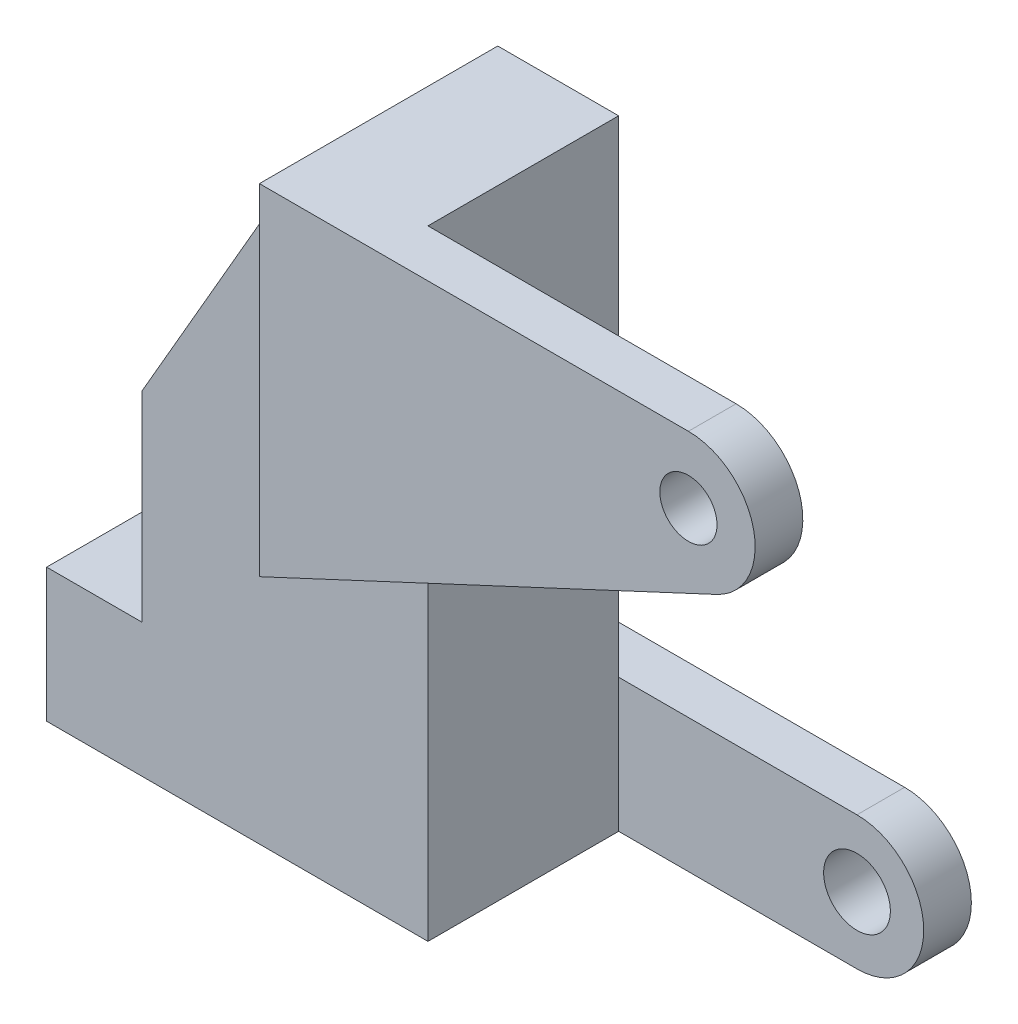
ISO-10303-21;
HEADER;
FILE_DESCRIPTION(('STEP AP214'),'2;1');
FILE_NAME('part.step','',(''),(''),'','','');
FILE_SCHEMA(('AUTOMOTIVE_DESIGN { 1 0 10303 214 1 1 1 1 }'));
ENDSEC;
DATA;
#1=APPLICATION_CONTEXT('core data for automotive mechanical design processes');
#2=APPLICATION_PROTOCOL_DEFINITION('international standard','automotive_design',2000,#1);
#3=PRODUCT_CONTEXT('',#1,'mechanical');
#4=PRODUCT('Part','Part','',(#3));
#5=PRODUCT_RELATED_PRODUCT_CATEGORY('part','',(#4));
#6=PRODUCT_DEFINITION_FORMATION('','',#4);
#7=PRODUCT_DEFINITION_CONTEXT('part definition',#1,'design');
#8=PRODUCT_DEFINITION('design','',#6,#7);
#9=PRODUCT_DEFINITION_SHAPE('','',#8);
#10=(LENGTH_UNIT() NAMED_UNIT(*) SI_UNIT(.MILLI.,.METRE.));
#11=(NAMED_UNIT(*) PLANE_ANGLE_UNIT() SI_UNIT($,.RADIAN.));
#12=(NAMED_UNIT(*) SI_UNIT($,.STERADIAN.) SOLID_ANGLE_UNIT());
#13=UNCERTAINTY_MEASURE_WITH_UNIT(LENGTH_MEASURE(1.E-05),#10,'distance_accuracy_value','');
#14=(GEOMETRIC_REPRESENTATION_CONTEXT(3) GLOBAL_UNCERTAINTY_ASSIGNED_CONTEXT((#13)) GLOBAL_UNIT_ASSIGNED_CONTEXT((#10,
#11,#12)) REPRESENTATION_CONTEXT('',''));
#15=CARTESIAN_POINT('',(0.,0.,0.));
#16=DIRECTION('',(0.,0.,1.));
#17=DIRECTION('',(1.,0.,0.));
#18=AXIS2_PLACEMENT_3D('',#15,#16,#17);
#19=CARTESIAN_POINT('',(0.,0.,0.));
#20=DIRECTION('',(0.,0.,-1.));
#21=DIRECTION('',(-1.,0.,0.));
#22=AXIS2_PLACEMENT_3D('',#19,#20,#21);
#23=PLANE('',#22);
#24=DIRECTION('',(-1.,0.,0.));
#25=VECTOR('',#24,1.);
#26=CARTESIAN_POINT('',(0.,14.,0.));
#27=LINE('',#26,#25);
#28=CARTESIAN_POINT('',(10.,14.,0.));
#29=VERTEX_POINT('',#28);
#30=CARTESIAN_POINT('',(0.,14.,0.));
#31=VERTEX_POINT('',#30);
#32=EDGE_CURVE('E218',#29,#31,#27,.T.);
#33=ORIENTED_EDGE('',*,*,#32,.F.);
#34=DIRECTION('',(0.,-1.,0.));
#35=VECTOR('',#34,1.);
#36=CARTESIAN_POINT('',(10.,0.,0.));
#37=LINE('',#36,#35);
#38=CARTESIAN_POINT('',(10.,0.,0.));
#39=VERTEX_POINT('',#38);
#40=EDGE_CURVE('E272',#29,#39,#37,.T.);
#41=ORIENTED_EDGE('',*,*,#40,.T.);
#42=DIRECTION('',(1.,0.,0.));
#43=VECTOR('',#42,1.);
#44=CARTESIAN_POINT('',(0.,0.,0.));
#45=LINE('',#44,#43);
#46=CARTESIAN_POINT('',(0.,0.,0.));
#47=VERTEX_POINT('',#46);
#48=EDGE_CURVE('E235',#47,#39,#45,.T.);
#49=ORIENTED_EDGE('',*,*,#48,.F.);
#50=DIRECTION('',(0.,-1.,0.));
#51=VECTOR('',#50,1.);
#52=CARTESIAN_POINT('',(0.,0.,0.));
#53=LINE('',#52,#51);
#54=EDGE_CURVE('E212',#31,#47,#53,.T.);
#55=ORIENTED_EDGE('',*,*,#54,.F.);
#56=EDGE_LOOP('',(#33,#41,#49,#55));
#57=FACE_BOUND('',#56,.T.);
#58=ADVANCED_FACE('F39',(#57),#23,.T.);
#59=CARTESIAN_POINT('',(0.,0.,20.));
#60=DIRECTION('',(1.,0.,0.));
#61=DIRECTION('',(0.,0.,-1.));
#62=AXIS2_PLACEMENT_3D('',#59,#60,#61);
#63=PLANE('',#62);
#64=ORIENTED_EDGE('',*,*,#54,.T.);
#65=DIRECTION('',(0.,0.,-1.));
#66=VECTOR('',#65,1.);
#67=CARTESIAN_POINT('',(0.,0.,20.));
#68=LINE('',#67,#66);
#69=CARTESIAN_POINT('',(0.,0.,20.));
#70=VERTEX_POINT('',#69);
#71=EDGE_CURVE('E43',#70,#47,#68,.T.);
#72=ORIENTED_EDGE('',*,*,#71,.F.);
#73=DIRECTION('',(0.,-1.,0.));
#74=VECTOR('',#73,1.);
#75=CARTESIAN_POINT('',(0.,0.,20.));
#76=LINE('',#75,#74);
#77=CARTESIAN_POINT('',(0.,14.,20.));
#78=VERTEX_POINT('',#77);
#79=EDGE_CURVE('E214',#78,#70,#76,.T.);
#80=ORIENTED_EDGE('',*,*,#79,.F.);
#81=DIRECTION('',(0.,0.,-1.));
#82=VECTOR('',#81,1.);
#83=CARTESIAN_POINT('',(0.,14.,20.));
#84=LINE('',#83,#82);
#85=EDGE_CURVE('E226',#78,#31,#84,.T.);
#86=ORIENTED_EDGE('',*,*,#85,.T.);
#87=EDGE_LOOP('',(#64,#72,#80,#86));
#88=FACE_BOUND('',#87,.T.);
#89=ADVANCED_FACE('F41',(#88),#63,.F.);
#90=CARTESIAN_POINT('',(0.,0.,20.));
#91=DIRECTION('',(0.,1.,0.));
#92=DIRECTION('',(0.,0.,1.));
#93=AXIS2_PLACEMENT_3D('',#90,#91,#92);
#94=PLANE('',#93);
#95=ORIENTED_EDGE('',*,*,#48,.T.);
#96=DIRECTION('',(0.,0.,1.));
#97=VECTOR('',#96,1.);
#98=CARTESIAN_POINT('',(10.,0.,-5.));
#99=LINE('',#98,#97);
#100=CARTESIAN_POINT('',(10.,0.,-5.));
#101=VERTEX_POINT('',#100);
#102=EDGE_CURVE('E57',#101,#39,#99,.T.);
#103=ORIENTED_EDGE('',*,*,#102,.F.);
#104=DIRECTION('',(-1.,0.,0.));
#105=VECTOR('',#104,1.);
#106=CARTESIAN_POINT('',(0.,0.,-5.));
#107=LINE('',#106,#105);
#108=CARTESIAN_POINT('',(65.,0.,-5.));
#109=VERTEX_POINT('',#108);
#110=EDGE_CURVE('E157',#109,#101,#107,.T.);
#111=ORIENTED_EDGE('',*,*,#110,.F.);
#112=DIRECTION('',(0.,0.,1.));
#113=VECTOR('',#112,1.);
#114=CARTESIAN_POINT('',(65.,0.,-5.));
#115=LINE('',#114,#113);
#116=CARTESIAN_POINT('',(65.,0.,0.));
#117=VERTEX_POINT('',#116);
#118=EDGE_CURVE('E156',#109,#117,#115,.T.);
#119=ORIENTED_EDGE('',*,*,#118,.T.);
#120=DIRECTION('',(-1.,0.,0.));
#121=VECTOR('',#120,1.);
#122=CARTESIAN_POINT('',(0.,0.,0.));
#123=LINE('',#122,#121);
#124=CARTESIAN_POINT('',(40.,0.,0.));
#125=VERTEX_POINT('',#124);
#126=EDGE_CURVE('E274',#117,#125,#123,.T.);
#127=ORIENTED_EDGE('',*,*,#126,.T.);
#128=DIRECTION('',(0.,0.,-1.));
#129=VECTOR('',#128,1.);
#130=CARTESIAN_POINT('',(40.,0.,20.));
#131=LINE('',#130,#129);
#132=CARTESIAN_POINT('',(40.,0.,20.));
#133=VERTEX_POINT('',#132);
#134=EDGE_CURVE('E257',#133,#125,#131,.T.);
#135=ORIENTED_EDGE('',*,*,#134,.F.);
#136=DIRECTION('',(1.,0.,0.));
#137=VECTOR('',#136,1.);
#138=CARTESIAN_POINT('',(0.,0.,20.));
#139=LINE('',#138,#137);
#140=EDGE_CURVE('E217',#70,#133,#139,.T.);
#141=ORIENTED_EDGE('',*,*,#140,.F.);
#142=ORIENTED_EDGE('',*,*,#71,.T.);
#143=EDGE_LOOP('',(#95,#103,#111,#119,#127,#135,#141,#142));
#144=FACE_BOUND('',#143,.T.);
#145=ADVANCED_FACE('F266',(#144),#94,.F.);
#146=CARTESIAN_POINT('',(40.,0.,20.));
#147=DIRECTION('',(-1.,0.,0.));
#148=DIRECTION('',(0.,0.,1.));
#149=AXIS2_PLACEMENT_3D('',#146,#147,#148);
#150=PLANE('',#149);
#151=DIRECTION('',(0.,1.,0.));
#152=VECTOR('',#151,1.);
#153=CARTESIAN_POINT('',(40.,0.,0.));
#154=LINE('',#153,#152);
#155=CARTESIAN_POINT('',(40.,14.,0.));
#156=VERTEX_POINT('',#155);
#157=EDGE_CURVE('E237',#125,#156,#154,.T.);
#158=ORIENTED_EDGE('',*,*,#157,.T.);
#159=CARTESIAN_POINT('',(40.,65.,0.));
#160=VERTEX_POINT('',#159);
#161=EDGE_CURVE('E233',#156,#160,#154,.T.);
#162=ORIENTED_EDGE('',*,*,#161,.T.);
#163=DIRECTION('',(0.,0.,-1.));
#164=VECTOR('',#163,1.);
#165=CARTESIAN_POINT('',(40.,65.,20.));
#166=LINE('',#165,#164);
#167=CARTESIAN_POINT('',(40.,65.,20.));
#168=VERTEX_POINT('',#167);
#169=EDGE_CURVE('E256',#168,#160,#166,.T.);
#170=ORIENTED_EDGE('',*,*,#169,.F.);
#171=DIRECTION('',(0.,1.,0.));
#172=VECTOR('',#171,1.);
#173=CARTESIAN_POINT('',(40.,0.,20.));
#174=LINE('',#173,#172);
#175=CARTESIAN_POINT('',(40.,35.2050541361082,20.));
#176=VERTEX_POINT('',#175);
#177=EDGE_CURVE('E61',#176,#168,#174,.T.);
#178=ORIENTED_EDGE('',*,*,#177,.F.);
#179=EDGE_CURVE('E222',#133,#176,#174,.T.);
#180=ORIENTED_EDGE('',*,*,#179,.F.);
#181=ORIENTED_EDGE('',*,*,#134,.T.);
#182=EDGE_LOOP('',(#158,#162,#170,#178,#180,#181));
#183=FACE_BOUND('',#182,.T.);
#184=ADVANCED_FACE('F299',(#183),#150,.F.);
#185=CARTESIAN_POINT('',(40.,65.,20.));
#186=DIRECTION('',(0.,-1.,0.));
#187=DIRECTION('',(0.,0.,-1.));
#188=AXIS2_PLACEMENT_3D('',#185,#186,#187);
#189=PLANE('',#188);
#190=DIRECTION('',(-1.,0.,0.));
#191=VECTOR('',#190,1.);
#192=CARTESIAN_POINT('',(40.,65.,0.));
#193=LINE('',#192,#191);
#194=CARTESIAN_POINT('',(27.3205080756888,65.,0.));
#195=VERTEX_POINT('',#194);
#196=EDGE_CURVE('E239',#160,#195,#193,.T.);
#197=ORIENTED_EDGE('',*,*,#196,.T.);
#198=DIRECTION('',(0.,0.,-1.));
#199=VECTOR('',#198,1.);
#200=CARTESIAN_POINT('',(27.3205080756888,65.,20.));
#201=LINE('',#200,#199);
#202=CARTESIAN_POINT('',(27.3205080756888,65.,20.));
#203=VERTEX_POINT('',#202);
#204=EDGE_CURVE('E254',#203,#195,#201,.T.);
#205=ORIENTED_EDGE('',*,*,#204,.F.);
#206=DIRECTION('',(0.,0.,-1.));
#207=VECTOR('',#206,1.);
#208=CARTESIAN_POINT('',(27.3205080756888,65.,25.));
#209=LINE('',#208,#207);
#210=CARTESIAN_POINT('',(27.3205080756888,65.,25.));
#211=VERTEX_POINT('',#210);
#212=EDGE_CURVE('E211',#211,#203,#209,.T.);
#213=ORIENTED_EDGE('',*,*,#212,.F.);
#214=DIRECTION('',(-1.,0.,0.));
#215=VECTOR('',#214,1.);
#216=CARTESIAN_POINT('',(0.,65.,25.));
#217=LINE('',#216,#215);
#218=CARTESIAN_POINT('',(72.3205080756888,65.,25.));
#219=VERTEX_POINT('',#218);
#220=EDGE_CURVE('E185',#219,#211,#217,.T.);
#221=ORIENTED_EDGE('',*,*,#220,.F.);
#222=DIRECTION('',(0.,0.,-1.));
#223=VECTOR('',#222,1.);
#224=CARTESIAN_POINT('',(72.3205080756888,65.,25.));
#225=LINE('',#224,#223);
#226=CARTESIAN_POINT('',(72.3205080756888,65.,20.));
#227=VERTEX_POINT('',#226);
#228=EDGE_CURVE('E193',#219,#227,#225,.T.);
#229=ORIENTED_EDGE('',*,*,#228,.T.);
#230=DIRECTION('',(-1.,0.,0.));
#231=VECTOR('',#230,1.);
#232=CARTESIAN_POINT('',(0.,65.,20.));
#233=LINE('',#232,#231);
#234=EDGE_CURVE('E171',#227,#168,#233,.T.);
#235=ORIENTED_EDGE('',*,*,#234,.T.);
#236=ORIENTED_EDGE('',*,*,#169,.T.);
#237=EDGE_LOOP('',(#197,#205,#213,#221,#229,#235,#236));
#238=FACE_BOUND('',#237,.T.);
#239=ADVANCED_FACE('F304',(#238),#189,.F.);
#240=CARTESIAN_POINT('',(10.,35.,20.));
#241=DIRECTION('',(0.866025403784438,-0.500000000000001,0.));
#242=DIRECTION('',(0.500000000000001,0.866025403784438,0.));
#243=AXIS2_PLACEMENT_3D('',#240,#241,#242);
#244=PLANE('',#243);
#245=DIRECTION('',(-0.500000000000001,-0.866025403784438,0.));
#246=VECTOR('',#245,1.);
#247=CARTESIAN_POINT('',(10.,35.,0.));
#248=LINE('',#247,#246);
#249=CARTESIAN_POINT('',(10.,35.,0.));
#250=VERTEX_POINT('',#249);
#251=EDGE_CURVE('E242',#195,#250,#248,.T.);
#252=ORIENTED_EDGE('',*,*,#251,.T.);
#253=DIRECTION('',(0.,0.,-1.));
#254=VECTOR('',#253,1.);
#255=CARTESIAN_POINT('',(10.,35.,20.));
#256=LINE('',#255,#254);
#257=CARTESIAN_POINT('',(10.,35.,20.));
#258=VERTEX_POINT('',#257);
#259=EDGE_CURVE('E252',#258,#250,#256,.T.);
#260=ORIENTED_EDGE('',*,*,#259,.F.);
#261=DIRECTION('',(-0.500000000000001,-0.866025403784438,0.));
#262=VECTOR('',#261,1.);
#263=CARTESIAN_POINT('',(10.,35.,20.));
#264=LINE('',#263,#262);
#265=EDGE_CURVE('E224',#203,#258,#264,.T.);
#266=ORIENTED_EDGE('',*,*,#265,.F.);
#267=ORIENTED_EDGE('',*,*,#204,.T.);
#268=EDGE_LOOP('',(#252,#260,#266,#267));
#269=FACE_BOUND('',#268,.T.);
#270=ADVANCED_FACE('F313',(#269),#244,.F.);
#271=CARTESIAN_POINT('',(10.,14.,20.));
#272=DIRECTION('',(1.,0.,0.));
#273=DIRECTION('',(0.,0.,-1.));
#274=AXIS2_PLACEMENT_3D('',#271,#272,#273);
#275=PLANE('',#274);
#276=DIRECTION('',(0.,-1.,0.));
#277=VECTOR('',#276,1.);
#278=CARTESIAN_POINT('',(10.,14.,0.));
#279=LINE('',#278,#277);
#280=EDGE_CURVE('E244',#250,#29,#279,.T.);
#281=ORIENTED_EDGE('',*,*,#280,.T.);
#282=DIRECTION('',(0.,0.,-1.));
#283=VECTOR('',#282,1.);
#284=CARTESIAN_POINT('',(10.,14.,20.));
#285=LINE('',#284,#283);
#286=CARTESIAN_POINT('',(10.,14.,20.));
#287=VERTEX_POINT('',#286);
#288=EDGE_CURVE('E246',#287,#29,#285,.T.);
#289=ORIENTED_EDGE('',*,*,#288,.F.);
#290=DIRECTION('',(0.,-1.,0.));
#291=VECTOR('',#290,1.);
#292=CARTESIAN_POINT('',(10.,14.,20.));
#293=LINE('',#292,#291);
#294=EDGE_CURVE('E223',#258,#287,#293,.T.);
#295=ORIENTED_EDGE('',*,*,#294,.F.);
#296=ORIENTED_EDGE('',*,*,#259,.T.);
#297=EDGE_LOOP('',(#281,#289,#295,#296));
#298=FACE_BOUND('',#297,.T.);
#299=ADVANCED_FACE('F312',(#298),#275,.F.);
#300=CARTESIAN_POINT('',(0.,14.,20.));
#301=DIRECTION('',(0.,-1.,0.));
#302=DIRECTION('',(0.,0.,-1.));
#303=AXIS2_PLACEMENT_3D('',#300,#301,#302);
#304=PLANE('',#303);
#305=ORIENTED_EDGE('',*,*,#32,.T.);
#306=ORIENTED_EDGE('',*,*,#85,.F.);
#307=DIRECTION('',(-1.,0.,0.));
#308=VECTOR('',#307,1.);
#309=CARTESIAN_POINT('',(0.,14.,20.));
#310=LINE('',#309,#308);
#311=EDGE_CURVE('E230',#287,#78,#310,.T.);
#312=ORIENTED_EDGE('',*,*,#311,.F.);
#313=ORIENTED_EDGE('',*,*,#288,.T.);
#314=EDGE_LOOP('',(#305,#306,#312,#313));
#315=FACE_BOUND('',#314,.T.);
#316=ADVANCED_FACE('F370',(#315),#304,.F.);
#317=CARTESIAN_POINT('',(0.,0.,20.));
#318=DIRECTION('',(0.,0.,-1.));
#319=DIRECTION('',(-1.,0.,0.));
#320=AXIS2_PLACEMENT_3D('',#317,#318,#319);
#321=PLANE('',#320);
#322=ORIENTED_EDGE('',*,*,#179,.T.);
#323=DIRECTION('',(-0.906307787036648,-0.422618261740704,0.));
#324=VECTOR('',#323,1.);
#325=CARTESIAN_POINT('',(-6.34007023906498,13.5963245041914,20.));
#326=LINE('',#325,#324);
#327=CARTESIAN_POINT('',(27.3205080756888,29.2925099502874,20.));
#328=VERTEX_POINT('',#327);
#329=EDGE_CURVE('E11',#176,#328,#326,.T.);
#330=ORIENTED_EDGE('',*,*,#329,.T.);
#331=DIRECTION('',(0.,-1.,0.));
#332=VECTOR('',#331,1.);
#333=CARTESIAN_POINT('',(27.3205080756888,0.,20.));
#334=LINE('',#333,#332);
#335=EDGE_CURVE('E180',#203,#328,#334,.T.);
#336=ORIENTED_EDGE('',*,*,#335,.F.);
#337=ORIENTED_EDGE('',*,*,#265,.T.);
#338=ORIENTED_EDGE('',*,*,#294,.T.);
#339=ORIENTED_EDGE('',*,*,#311,.T.);
#340=ORIENTED_EDGE('',*,*,#79,.T.);
#341=ORIENTED_EDGE('',*,*,#140,.T.);
#342=EDGE_LOOP('',(#322,#330,#336,#337,#338,#339,#340,#341));
#343=FACE_BOUND('',#342,.T.);
#344=ADVANCED_FACE('F317',(#343),#321,.F.);
#345=DIRECTION('',(1.,0.,0.));
#346=VECTOR('',#345,1.);
#347=CARTESIAN_POINT('',(0.,14.,0.));
#348=LINE('',#347,#346);
#349=EDGE_CURVE('E291',#29,#156,#348,.T.);
#350=ORIENTED_EDGE('',*,*,#349,.F.);
#351=ORIENTED_EDGE('',*,*,#280,.F.);
#352=ORIENTED_EDGE('',*,*,#251,.F.);
#353=ORIENTED_EDGE('',*,*,#196,.F.);
#354=ORIENTED_EDGE('',*,*,#161,.F.);
#355=EDGE_LOOP('',(#350,#351,#352,#353,#354));
#356=FACE_BOUND('',#355,.T.);
#357=ADVANCED_FACE('F307',(#356),#23,.T.);
#358=CARTESIAN_POINT('',(0.,0.,20.));
#359=DIRECTION('',(0.,0.,1.));
#360=DIRECTION('',(1.,0.,0.));
#361=AXIS2_PLACEMENT_3D('',#358,#359,#360);
#362=PLANE('',#361);
#363=CARTESIAN_POINT('',(72.3205080756888,58.,20.));
#364=DIRECTION('',(0.,0.,1.));
#365=DIRECTION('',(1.,0.,0.));
#366=AXIS2_PLACEMENT_3D('',#363,#364,#365);
#367=CIRCLE('',#366,3.00000000000001);
#368=CARTESIAN_POINT('',(75.3205080756888,58.,20.));
#369=VERTEX_POINT('',#368);
#370=EDGE_CURVE('E187',#369,#369,#367,.T.);
#371=ORIENTED_EDGE('',*,*,#370,.T.);
#372=EDGE_LOOP('',(#371));
#373=FACE_BOUND('',#372,.T.);
#374=CARTESIAN_POINT('',(75.2788359078737,51.6558454907435,20.));
#375=VERTEX_POINT('',#374);
#376=EDGE_CURVE('E47',#375,#176,#326,.T.);
#377=ORIENTED_EDGE('',*,*,#376,.T.);
#378=ORIENTED_EDGE('',*,*,#177,.T.);
#379=ORIENTED_EDGE('',*,*,#234,.F.);
#380=CARTESIAN_POINT('',(72.3205080756888,58.,20.));
#381=DIRECTION('',(0.,0.,1.));
#382=DIRECTION('',(1.,0.,0.));
#383=AXIS2_PLACEMENT_3D('',#380,#381,#382);
#384=CIRCLE('',#383,7.);
#385=EDGE_CURVE('E199',#375,#227,#384,.T.);
#386=ORIENTED_EDGE('',*,*,#385,.F.);
#387=EDGE_LOOP('',(#377,#378,#379,#386));
#388=FACE_BOUND('',#387,.T.);
#389=ADVANCED_FACE('F337',(#373,#388),#362,.F.);
#390=CARTESIAN_POINT('',(27.3205080756888,0.,25.));
#391=DIRECTION('',(1.,0.,0.));
#392=DIRECTION('',(0.,1.,0.));
#393=AXIS2_PLACEMENT_3D('',#390,#391,#392);
#394=PLANE('',#393);
#395=ORIENTED_EDGE('',*,*,#335,.T.);
#396=DIRECTION('',(0.,0.,-1.));
#397=VECTOR('',#396,1.);
#398=CARTESIAN_POINT('',(27.3205080756888,29.2925099502874,25.));
#399=LINE('',#398,#397);
#400=CARTESIAN_POINT('',(27.3205080756888,29.2925099502874,25.));
#401=VERTEX_POINT('',#400);
#402=EDGE_CURVE('E208',#401,#328,#399,.T.);
#403=ORIENTED_EDGE('',*,*,#402,.F.);
#404=DIRECTION('',(0.,-1.,0.));
#405=VECTOR('',#404,1.);
#406=CARTESIAN_POINT('',(27.3205080756888,0.,25.));
#407=LINE('',#406,#405);
#408=EDGE_CURVE('E183',#211,#401,#407,.T.);
#409=ORIENTED_EDGE('',*,*,#408,.F.);
#410=ORIENTED_EDGE('',*,*,#212,.T.);
#411=EDGE_LOOP('',(#395,#403,#409,#410));
#412=FACE_BOUND('',#411,.T.);
#413=ADVANCED_FACE('F325',(#412),#394,.F.);
#414=CARTESIAN_POINT('',(-6.34007023906498,13.5963245041914,25.));
#415=DIRECTION('',(0.422618261740704,-0.906307787036648,0.));
#416=DIRECTION('',(0.906307787036648,0.422618261740704,0.));
#417=AXIS2_PLACEMENT_3D('',#414,#415,#416);
#418=PLANE('',#417);
#419=ORIENTED_EDGE('',*,*,#376,.F.);
#420=DIRECTION('',(0.,0.,-1.));
#421=VECTOR('',#420,1.);
#422=CARTESIAN_POINT('',(75.2788359078737,51.6558454907435,25.));
#423=LINE('',#422,#421);
#424=CARTESIAN_POINT('',(75.2788359078737,51.6558454907435,25.));
#425=VERTEX_POINT('',#424);
#426=EDGE_CURVE('E206',#425,#375,#423,.T.);
#427=ORIENTED_EDGE('',*,*,#426,.F.);
#428=DIRECTION('',(-0.906307787036648,-0.422618261740704,0.));
#429=VECTOR('',#428,1.);
#430=CARTESIAN_POINT('',(-6.34007023906498,13.5963245041914,25.));
#431=LINE('',#430,#429);
#432=EDGE_CURVE('E189',#425,#401,#431,.T.);
#433=ORIENTED_EDGE('',*,*,#432,.T.);
#434=ORIENTED_EDGE('',*,*,#402,.T.);
#435=ORIENTED_EDGE('',*,*,#329,.F.);
#436=EDGE_LOOP('',(#419,#427,#433,#434,#435));
#437=FACE_BOUND('',#436,.T.);
#438=ADVANCED_FACE('F336',(#437),#418,.T.);
#439=CARTESIAN_POINT('',(72.3205080756888,58.,25.));
#440=DIRECTION('',(0.,0.,-1.));
#441=DIRECTION('',(-1.,0.,0.));
#442=AXIS2_PLACEMENT_3D('',#439,#440,#441);
#443=CYLINDRICAL_SURFACE('',#442,7.);
#444=ORIENTED_EDGE('',*,*,#385,.T.);
#445=ORIENTED_EDGE('',*,*,#228,.F.);
#446=CARTESIAN_POINT('',(72.3205080756888,58.,25.));
#447=DIRECTION('',(0.,0.,1.));
#448=DIRECTION('',(1.,0.,0.));
#449=AXIS2_PLACEMENT_3D('',#446,#447,#448);
#450=CIRCLE('',#449,7.);
#451=EDGE_CURVE('E192',#425,#219,#450,.T.);
#452=ORIENTED_EDGE('',*,*,#451,.F.);
#453=ORIENTED_EDGE('',*,*,#426,.T.);
#454=EDGE_LOOP('',(#444,#445,#452,#453));
#455=FACE_BOUND('',#454,.T.);
#456=ADVANCED_FACE('F335',(#455),#443,.T.);
#457=CARTESIAN_POINT('',(72.3205080756888,58.,25.));
#458=DIRECTION('',(0.,0.,-1.));
#459=DIRECTION('',(-1.,0.,0.));
#460=AXIS2_PLACEMENT_3D('',#457,#458,#459);
#461=CYLINDRICAL_SURFACE('',#460,3.00000000000001);
#462=CARTESIAN_POINT('',(72.3205080756888,58.,25.));
#463=DIRECTION('',(0.,0.,1.));
#464=DIRECTION('',(1.,0.,0.));
#465=AXIS2_PLACEMENT_3D('',#462,#463,#464);
#466=CIRCLE('',#465,3.00000000000001);
#467=CARTESIAN_POINT('',(75.3205080756888,58.,25.));
#468=VERTEX_POINT('',#467);
#469=EDGE_CURVE('E194',#468,#468,#466,.T.);
#470=ORIENTED_EDGE('',*,*,#469,.T.);
#471=EDGE_LOOP('',(#470));
#472=FACE_BOUND('',#471,.T.);
#473=ORIENTED_EDGE('',*,*,#370,.F.);
#474=EDGE_LOOP('',(#473));
#475=FACE_BOUND('',#474,.T.);
#476=ADVANCED_FACE('F347',(#472,#475),#461,.F.);
#477=CARTESIAN_POINT('',(0.,0.,25.));
#478=DIRECTION('',(0.,0.,1.));
#479=DIRECTION('',(1.,0.,0.));
#480=AXIS2_PLACEMENT_3D('',#477,#478,#479);
#481=PLANE('',#480);
#482=ORIENTED_EDGE('',*,*,#220,.T.);
#483=ORIENTED_EDGE('',*,*,#408,.T.);
#484=ORIENTED_EDGE('',*,*,#432,.F.);
#485=ORIENTED_EDGE('',*,*,#451,.T.);
#486=EDGE_LOOP('',(#482,#483,#484,#485));
#487=FACE_BOUND('',#486,.T.);
#488=ORIENTED_EDGE('',*,*,#469,.F.);
#489=EDGE_LOOP('',(#488));
#490=FACE_BOUND('',#489,.T.);
#491=ADVANCED_FACE('F330',(#487,#490),#481,.T.);
#492=CARTESIAN_POINT('',(0.,14.,-5.));
#493=DIRECTION('',(0.,-1.,0.));
#494=DIRECTION('',(1.,0.,0.));
#495=AXIS2_PLACEMENT_3D('',#492,#493,#494);
#496=PLANE('',#495);
#497=ORIENTED_EDGE('',*,*,#349,.T.);
#498=CARTESIAN_POINT('',(65.,14.,0.));
#499=VERTEX_POINT('',#498);
#500=EDGE_CURVE('E175',#156,#499,#348,.T.);
#501=ORIENTED_EDGE('',*,*,#500,.T.);
#502=DIRECTION('',(0.,0.,1.));
#503=VECTOR('',#502,1.);
#504=CARTESIAN_POINT('',(65.,14.,-5.));
#505=LINE('',#504,#503);
#506=CARTESIAN_POINT('',(65.,14.,-5.));
#507=VERTEX_POINT('',#506);
#508=EDGE_CURVE('E152',#507,#499,#505,.T.);
#509=ORIENTED_EDGE('',*,*,#508,.F.);
#510=DIRECTION('',(1.,0.,0.));
#511=VECTOR('',#510,1.);
#512=CARTESIAN_POINT('',(0.,14.,-5.));
#513=LINE('',#512,#511);
#514=CARTESIAN_POINT('',(10.,14.,-5.));
#515=VERTEX_POINT('',#514);
#516=EDGE_CURVE('E159',#515,#507,#513,.T.);
#517=ORIENTED_EDGE('',*,*,#516,.F.);
#518=DIRECTION('',(0.,0.,1.));
#519=VECTOR('',#518,1.);
#520=CARTESIAN_POINT('',(10.,14.,-5.));
#521=LINE('',#520,#519);
#522=EDGE_CURVE('E281',#515,#29,#521,.T.);
#523=ORIENTED_EDGE('',*,*,#522,.T.);
#524=EDGE_LOOP('',(#497,#501,#509,#517,#523));
#525=FACE_BOUND('',#524,.T.);
#526=ADVANCED_FACE('F172',(#525),#496,.F.);
#527=CARTESIAN_POINT('',(65.,6.99999999999999,-5.));
#528=DIRECTION('',(0.,0.,1.));
#529=DIRECTION('',(1.,0.,0.));
#530=AXIS2_PLACEMENT_3D('',#527,#528,#529);
#531=CYLINDRICAL_SURFACE('',#530,7.);
#532=CARTESIAN_POINT('',(65.,6.99999999999999,0.));
#533=DIRECTION('',(0.,0.,-1.));
#534=DIRECTION('',(-1.,0.,0.));
#535=AXIS2_PLACEMENT_3D('',#532,#533,#534);
#536=CIRCLE('',#535,7.);
#537=EDGE_CURVE('E278',#499,#117,#536,.T.);
#538=ORIENTED_EDGE('',*,*,#537,.T.);
#539=ORIENTED_EDGE('',*,*,#118,.F.);
#540=CARTESIAN_POINT('',(65.,6.99999999999999,-5.));
#541=DIRECTION('',(0.,0.,-1.));
#542=DIRECTION('',(-1.,0.,0.));
#543=AXIS2_PLACEMENT_3D('',#540,#541,#542);
#544=CIRCLE('',#543,7.);
#545=EDGE_CURVE('E147',#507,#109,#544,.T.);
#546=ORIENTED_EDGE('',*,*,#545,.F.);
#547=ORIENTED_EDGE('',*,*,#508,.T.);
#548=EDGE_LOOP('',(#538,#539,#546,#547));
#549=FACE_BOUND('',#548,.T.);
#550=ADVANCED_FACE('F155',(#549),#531,.T.);
#551=CARTESIAN_POINT('',(10.,0.,-5.));
#552=DIRECTION('',(-1.,0.,0.));
#553=DIRECTION('',(0.,0.,1.));
#554=AXIS2_PLACEMENT_3D('',#551,#552,#553);
#555=PLANE('',#554);
#556=ORIENTED_EDGE('',*,*,#40,.F.);
#557=ORIENTED_EDGE('',*,*,#522,.F.);
#558=DIRECTION('',(0.,-1.,0.));
#559=VECTOR('',#558,1.);
#560=CARTESIAN_POINT('',(10.,0.,-5.));
#561=LINE('',#560,#559);
#562=EDGE_CURVE('E167',#515,#101,#561,.T.);
#563=ORIENTED_EDGE('',*,*,#562,.T.);
#564=ORIENTED_EDGE('',*,*,#102,.T.);
#565=EDGE_LOOP('',(#556,#557,#563,#564));
#566=FACE_BOUND('',#565,.T.);
#567=ADVANCED_FACE('F503',(#566),#555,.T.);
#568=CARTESIAN_POINT('',(65.,6.99999999999999,-5.));
#569=DIRECTION('',(0.,0.,1.));
#570=DIRECTION('',(1.,0.,0.));
#571=AXIS2_PLACEMENT_3D('',#568,#569,#570);
#572=CYLINDRICAL_SURFACE('',#571,3.5);
#573=CARTESIAN_POINT('',(65.,6.99999999999999,-5.));
#574=DIRECTION('',(0.,0.,-1.));
#575=DIRECTION('',(-1.,0.,0.));
#576=AXIS2_PLACEMENT_3D('',#573,#574,#575);
#577=CIRCLE('',#576,3.5);
#578=CARTESIAN_POINT('',(61.5,6.99999999999999,-5.));
#579=VERTEX_POINT('',#578);
#580=EDGE_CURVE('E283',#579,#579,#577,.T.);
#581=ORIENTED_EDGE('',*,*,#580,.T.);
#582=EDGE_LOOP('',(#581));
#583=FACE_BOUND('',#582,.T.);
#584=CARTESIAN_POINT('',(65.,6.99999999999999,0.));
#585=DIRECTION('',(0.,0.,-1.));
#586=DIRECTION('',(-1.,0.,0.));
#587=AXIS2_PLACEMENT_3D('',#584,#585,#586);
#588=CIRCLE('',#587,3.5);
#589=CARTESIAN_POINT('',(61.5,6.99999999999999,0.));
#590=VERTEX_POINT('',#589);
#591=EDGE_CURVE('E169',#590,#590,#588,.T.);
#592=ORIENTED_EDGE('',*,*,#591,.F.);
#593=EDGE_LOOP('',(#592));
#594=FACE_BOUND('',#593,.T.);
#595=ADVANCED_FACE('F511',(#583,#594),#572,.F.);
#596=CARTESIAN_POINT('',(0.,0.,-5.));
#597=DIRECTION('',(0.,0.,-1.));
#598=DIRECTION('',(-1.,0.,0.));
#599=AXIS2_PLACEMENT_3D('',#596,#597,#598);
#600=PLANE('',#599);
#601=ORIENTED_EDGE('',*,*,#516,.T.);
#602=ORIENTED_EDGE('',*,*,#545,.T.);
#603=ORIENTED_EDGE('',*,*,#110,.T.);
#604=ORIENTED_EDGE('',*,*,#562,.F.);
#605=EDGE_LOOP('',(#601,#602,#603,#604));
#606=FACE_BOUND('',#605,.T.);
#607=ORIENTED_EDGE('',*,*,#580,.F.);
#608=EDGE_LOOP('',(#607));
#609=FACE_BOUND('',#608,.T.);
#610=ADVANCED_FACE('F163',(#606,#609),#600,.T.);
#611=CARTESIAN_POINT('',(0.,0.,0.));
#612=DIRECTION('',(0.,0.,-1.));
#613=DIRECTION('',(-1.,0.,0.));
#614=AXIS2_PLACEMENT_3D('',#611,#612,#613);
#615=PLANE('',#614);
#616=ORIENTED_EDGE('',*,*,#157,.F.);
#617=ORIENTED_EDGE('',*,*,#126,.F.);
#618=ORIENTED_EDGE('',*,*,#537,.F.);
#619=ORIENTED_EDGE('',*,*,#500,.F.);
#620=EDGE_LOOP('',(#616,#617,#618,#619));
#621=FACE_BOUND('',#620,.T.);
#622=ORIENTED_EDGE('',*,*,#591,.T.);
#623=EDGE_LOOP('',(#622));
#624=FACE_BOUND('',#623,.T.);
#625=ADVANCED_FACE('F297',(#621,#624),#615,.F.);
#626=CLOSED_SHELL('',(#58,#89,#145,#184,#239,#270,#299,#316,#344,#357,#389,#413,#438,#456,#476,
#491,#526,#550,#567,#595,#610,#625));
#627=MANIFOLD_SOLID_BREP('B2',#626);
#628=ADVANCED_BREP_SHAPE_REPRESENTATION('',(#18,#627),#14);
#629=SHAPE_DEFINITION_REPRESENTATION(#9,#628);
ENDSEC;
END-ISO-10303-21;
